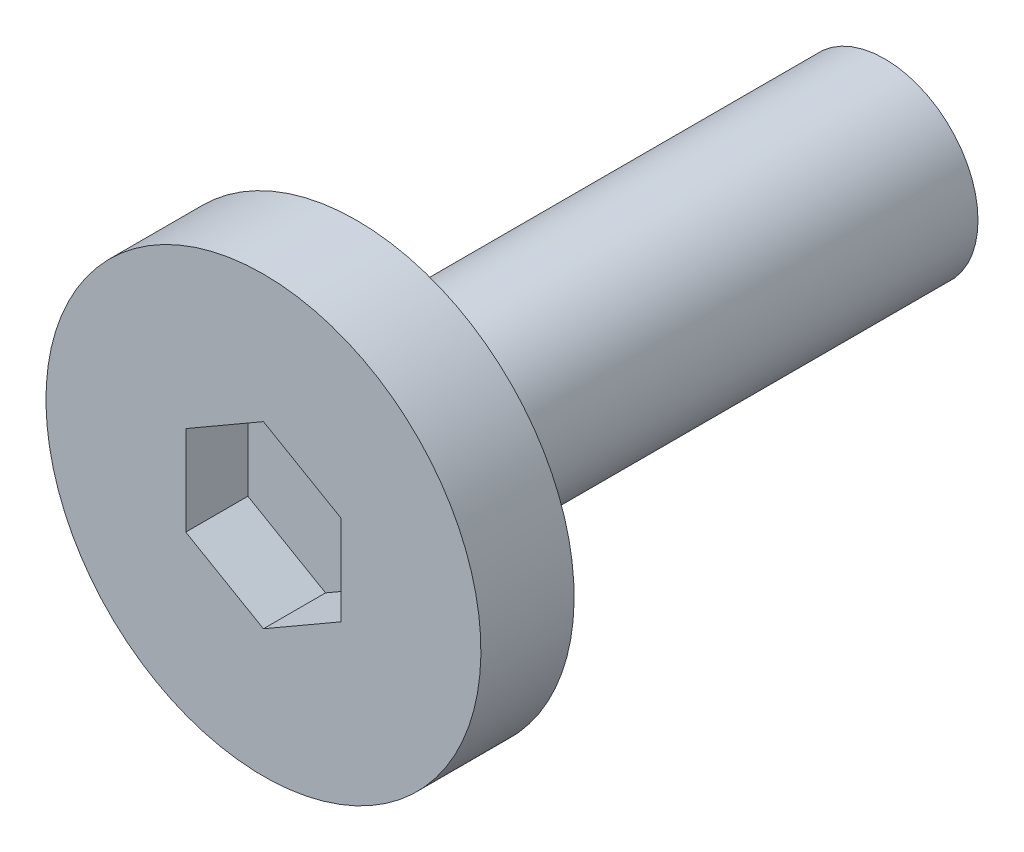
ISO-10303-21;
HEADER;
FILE_DESCRIPTION(('STEP AP214'),'2;1');
FILE_NAME('part.step','',(''),(''),'','','');
FILE_SCHEMA(('AUTOMOTIVE_DESIGN { 1 0 10303 214 1 1 1 1 }'));
ENDSEC;
DATA;
#1=APPLICATION_CONTEXT('core data for automotive mechanical design processes');
#2=APPLICATION_PROTOCOL_DEFINITION('international standard','automotive_design',2000,#1);
#3=PRODUCT_CONTEXT('',#1,'mechanical');
#4=PRODUCT('Part','Part','',(#3));
#5=PRODUCT_RELATED_PRODUCT_CATEGORY('part','',(#4));
#6=PRODUCT_DEFINITION_FORMATION('','',#4);
#7=PRODUCT_DEFINITION_CONTEXT('part definition',#1,'design');
#8=PRODUCT_DEFINITION('design','',#6,#7);
#9=PRODUCT_DEFINITION_SHAPE('','',#8);
#10=(LENGTH_UNIT() NAMED_UNIT(*) SI_UNIT(.MILLI.,.METRE.));
#11=(NAMED_UNIT(*) PLANE_ANGLE_UNIT() SI_UNIT($,.RADIAN.));
#12=(NAMED_UNIT(*) SI_UNIT($,.STERADIAN.) SOLID_ANGLE_UNIT());
#13=UNCERTAINTY_MEASURE_WITH_UNIT(LENGTH_MEASURE(1.E-05),#10,'distance_accuracy_value','');
#14=(GEOMETRIC_REPRESENTATION_CONTEXT(3) GLOBAL_UNCERTAINTY_ASSIGNED_CONTEXT((#13)) GLOBAL_UNIT_ASSIGNED_CONTEXT((#10,
#11,#12)) REPRESENTATION_CONTEXT('',''));
#15=CARTESIAN_POINT('',(0.,0.,0.));
#16=DIRECTION('',(0.,0.,1.));
#17=DIRECTION('',(1.,0.,0.));
#18=AXIS2_PLACEMENT_3D('',#15,#16,#17);
#19=CARTESIAN_POINT('',(172.530839914594,-193.837695743439,112.760489149574));
#20=DIRECTION('',(0.,0.,1.));
#21=DIRECTION('',(1.,0.,0.));
#22=AXIS2_PLACEMENT_3D('',#19,#20,#21);
#23=PLANE('',#22);
#24=DIRECTION('',(0.,-1.,0.));
#25=VECTOR('',#24,1.);
#26=CARTESIAN_POINT('',(171.280839914594,-193.116007906952,112.760489149574));
#27=LINE('',#26,#25);
#28=CARTESIAN_POINT('',(171.280839914594,-193.116007906952,112.760489149574));
#29=VERTEX_POINT('',#28);
#30=CARTESIAN_POINT('',(171.280839914594,-194.559383579927,112.760489149574));
#31=VERTEX_POINT('',#30);
#32=EDGE_CURVE('E139',#29,#31,#27,.T.);
#33=ORIENTED_EDGE('',*,*,#32,.T.);
#34=DIRECTION('',(-0.866025403784438,0.5,0.));
#35=VECTOR('',#34,1.);
#36=CARTESIAN_POINT('',(171.280839914594,-194.559383579927,112.760489149574));
#37=LINE('',#36,#35);
#38=CARTESIAN_POINT('',(172.530839914594,-195.281071416414,112.760489149574));
#39=VERTEX_POINT('',#38);
#40=EDGE_CURVE('E11',#39,#31,#37,.T.);
#41=ORIENTED_EDGE('',*,*,#40,.F.);
#42=DIRECTION('',(-0.866025403784439,-0.5,0.));
#43=VECTOR('',#42,1.);
#44=CARTESIAN_POINT('',(172.530839914594,-195.281071416414,112.760489149574));
#45=LINE('',#44,#43);
#46=CARTESIAN_POINT('',(173.780839914594,-194.559383579927,112.760489149574));
#47=VERTEX_POINT('',#46);
#48=EDGE_CURVE('E138',#47,#39,#45,.T.);
#49=ORIENTED_EDGE('',*,*,#48,.F.);
#50=DIRECTION('',(0.,1.,0.));
#51=VECTOR('',#50,1.);
#52=CARTESIAN_POINT('',(173.780839914594,-194.559383579927,112.760489149574));
#53=LINE('',#52,#51);
#54=CARTESIAN_POINT('',(173.780839914594,-193.116007906952,112.760489149574));
#55=VERTEX_POINT('',#54);
#56=EDGE_CURVE('E112',#47,#55,#53,.T.);
#57=ORIENTED_EDGE('',*,*,#56,.T.);
#58=DIRECTION('',(-0.866025403784439,0.5,0.));
#59=VECTOR('',#58,1.);
#60=CARTESIAN_POINT('',(173.780839914594,-193.116007906952,112.760489149574));
#61=LINE('',#60,#59);
#62=CARTESIAN_POINT('',(172.530839914594,-192.394320070465,112.760489149574));
#63=VERTEX_POINT('',#62);
#64=EDGE_CURVE('E109',#55,#63,#61,.T.);
#65=ORIENTED_EDGE('',*,*,#64,.T.);
#66=DIRECTION('',(-0.866025403784439,-0.5,0.));
#67=VECTOR('',#66,1.);
#68=CARTESIAN_POINT('',(172.530839914594,-192.394320070465,112.760489149574));
#69=LINE('',#68,#67);
#70=EDGE_CURVE('E149',#63,#29,#69,.T.);
#71=ORIENTED_EDGE('',*,*,#70,.T.);
#72=EDGE_LOOP('',(#33,#41,#49,#57,#65,#71));
#73=FACE_BOUND('',#72,.T.);
#74=ADVANCED_FACE('F43',(#73),#23,.T.);
#75=CARTESIAN_POINT('',(171.280839914594,-194.559383579927,116.960489149574));
#76=DIRECTION('',(0.5,0.866025403784438,0.));
#77=DIRECTION('',(0.,0.,-1.));
#78=AXIS2_PLACEMENT_3D('',#75,#76,#77);
#79=PLANE('',#78);
#80=DIRECTION('',(0.,0.,1.));
#81=VECTOR('',#80,1.);
#82=CARTESIAN_POINT('',(172.530839914594,-195.281071416414,116.960489149574));
#83=LINE('',#82,#81);
#84=CARTESIAN_POINT('',(172.530839914594,-195.281071416414,113.760489149574));
#85=VERTEX_POINT('',#84);
#86=EDGE_CURVE('E52',#39,#85,#83,.T.);
#87=ORIENTED_EDGE('',*,*,#86,.F.);
#88=ORIENTED_EDGE('',*,*,#40,.T.);
#89=DIRECTION('',(0.,0.,1.));
#90=VECTOR('',#89,1.);
#91=CARTESIAN_POINT('',(171.280839914594,-194.559383579927,116.960489149574));
#92=LINE('',#91,#90);
#93=CARTESIAN_POINT('',(171.280839914594,-194.559383579927,113.760489149574));
#94=VERTEX_POINT('',#93);
#95=EDGE_CURVE('E141',#31,#94,#92,.T.);
#96=ORIENTED_EDGE('',*,*,#95,.T.);
#97=DIRECTION('',(-0.866025403784438,0.5,0.));
#98=VECTOR('',#97,1.);
#99=CARTESIAN_POINT('',(171.905839914593,-194.92022749817,113.760489149574));
#100=LINE('',#99,#98);
#101=EDGE_CURVE('E135',#85,#94,#100,.T.);
#102=ORIENTED_EDGE('',*,*,#101,.F.);
#103=EDGE_LOOP('',(#87,#88,#96,#102));
#104=FACE_BOUND('',#103,.T.);
#105=ADVANCED_FACE('F169',(#104),#79,.T.);
#106=CARTESIAN_POINT('',(172.530839914594,-195.281071416414,116.960489149574));
#107=DIRECTION('',(-0.5,0.866025403784439,0.));
#108=DIRECTION('',(0.,0.,1.));
#109=AXIS2_PLACEMENT_3D('',#106,#107,#108);
#110=PLANE('',#109);
#111=DIRECTION('',(0.,0.,1.));
#112=VECTOR('',#111,1.);
#113=CARTESIAN_POINT('',(173.780839914594,-194.559383579927,116.960489149574));
#114=LINE('',#113,#112);
#115=CARTESIAN_POINT('',(173.780839914594,-194.559383579927,113.760489149574));
#116=VERTEX_POINT('',#115);
#117=EDGE_CURVE('E118',#47,#116,#114,.T.);
#118=ORIENTED_EDGE('',*,*,#117,.F.);
#119=ORIENTED_EDGE('',*,*,#48,.T.);
#120=ORIENTED_EDGE('',*,*,#86,.T.);
#121=DIRECTION('',(-0.866025403784439,-0.5,0.));
#122=VECTOR('',#121,1.);
#123=CARTESIAN_POINT('',(173.155839914593,-194.92022749817,113.760489149574));
#124=LINE('',#123,#122);
#125=EDGE_CURVE('E122',#116,#85,#124,.T.);
#126=ORIENTED_EDGE('',*,*,#125,.F.);
#127=EDGE_LOOP('',(#118,#119,#120,#126));
#128=FACE_BOUND('',#127,.T.);
#129=ADVANCED_FACE('F175',(#128),#110,.T.);
#130=CARTESIAN_POINT('',(173.780839914594,-194.559383579927,116.960489149574));
#131=DIRECTION('',(-1.,0.,0.));
#132=DIRECTION('',(0.,0.,1.));
#133=AXIS2_PLACEMENT_3D('',#130,#131,#132);
#134=PLANE('',#133);
#135=DIRECTION('',(0.,0.,1.));
#136=VECTOR('',#135,1.);
#137=CARTESIAN_POINT('',(173.780839914594,-193.116007906952,116.960489149574));
#138=LINE('',#137,#136);
#139=CARTESIAN_POINT('',(173.780839914594,-193.116007906952,113.760489149574));
#140=VERTEX_POINT('',#139);
#141=EDGE_CURVE('E102',#55,#140,#138,.T.);
#142=ORIENTED_EDGE('',*,*,#141,.F.);
#143=ORIENTED_EDGE('',*,*,#56,.F.);
#144=ORIENTED_EDGE('',*,*,#117,.T.);
#145=DIRECTION('',(0.,-1.,0.));
#146=VECTOR('',#145,1.);
#147=CARTESIAN_POINT('',(173.780839914594,-193.837695743439,113.760489149574));
#148=LINE('',#147,#146);
#149=EDGE_CURVE('E115',#140,#116,#148,.T.);
#150=ORIENTED_EDGE('',*,*,#149,.F.);
#151=EDGE_LOOP('',(#142,#143,#144,#150));
#152=FACE_BOUND('',#151,.T.);
#153=ADVANCED_FACE('F116',(#152),#134,.T.);
#154=CARTESIAN_POINT('',(173.780839914594,-193.116007906952,116.960489149574));
#155=DIRECTION('',(-0.5,-0.866025403784439,0.));
#156=DIRECTION('',(-0.866025403784439,0.5,0.));
#157=AXIS2_PLACEMENT_3D('',#154,#155,#156);
#158=PLANE('',#157);
#159=DIRECTION('',(0.,0.,1.));
#160=VECTOR('',#159,1.);
#161=CARTESIAN_POINT('',(172.530839914594,-192.394320070465,116.960489149574));
#162=LINE('',#161,#160);
#163=CARTESIAN_POINT('',(172.530839914594,-192.394320070465,113.760489149574));
#164=VERTEX_POINT('',#163);
#165=EDGE_CURVE('E150',#63,#164,#162,.T.);
#166=ORIENTED_EDGE('',*,*,#165,.F.);
#167=ORIENTED_EDGE('',*,*,#64,.F.);
#168=ORIENTED_EDGE('',*,*,#141,.T.);
#169=DIRECTION('',(0.866025403784439,-0.5,0.));
#170=VECTOR('',#169,1.);
#171=CARTESIAN_POINT('',(173.155839914593,-192.755163988709,113.760489149574));
#172=LINE('',#171,#170);
#173=EDGE_CURVE('E107',#164,#140,#172,.T.);
#174=ORIENTED_EDGE('',*,*,#173,.F.);
#175=EDGE_LOOP('',(#166,#167,#168,#174));
#176=FACE_BOUND('',#175,.T.);
#177=ADVANCED_FACE('F105',(#176),#158,.T.);
#178=CARTESIAN_POINT('',(172.530839914594,-192.394320070465,116.960489149574));
#179=DIRECTION('',(0.5,-0.866025403784439,0.));
#180=DIRECTION('',(0.,0.,-1.));
#181=AXIS2_PLACEMENT_3D('',#178,#179,#180);
#182=PLANE('',#181);
#183=DIRECTION('',(0.,0.,1.));
#184=VECTOR('',#183,1.);
#185=CARTESIAN_POINT('',(171.280839914594,-193.116007906952,116.960489149574));
#186=LINE('',#185,#184);
#187=CARTESIAN_POINT('',(171.280839914594,-193.116007906952,113.760489149574));
#188=VERTEX_POINT('',#187);
#189=EDGE_CURVE('E140',#29,#188,#186,.T.);
#190=ORIENTED_EDGE('',*,*,#189,.F.);
#191=ORIENTED_EDGE('',*,*,#70,.F.);
#192=ORIENTED_EDGE('',*,*,#165,.T.);
#193=DIRECTION('',(0.866025403784439,0.5,0.));
#194=VECTOR('',#193,1.);
#195=CARTESIAN_POINT('',(171.905839914593,-192.755163988709,113.760489149574));
#196=LINE('',#195,#194);
#197=EDGE_CURVE('E129',#188,#164,#196,.T.);
#198=ORIENTED_EDGE('',*,*,#197,.F.);
#199=EDGE_LOOP('',(#190,#191,#192,#198));
#200=FACE_BOUND('',#199,.T.);
#201=ADVANCED_FACE('F190',(#200),#182,.T.);
#202=CARTESIAN_POINT('',(171.280839914594,-193.116007906952,116.960489149574));
#203=DIRECTION('',(1.,0.,0.));
#204=DIRECTION('',(0.,1.,0.));
#205=AXIS2_PLACEMENT_3D('',#202,#203,#204);
#206=PLANE('',#205);
#207=ORIENTED_EDGE('',*,*,#95,.F.);
#208=ORIENTED_EDGE('',*,*,#32,.F.);
#209=ORIENTED_EDGE('',*,*,#189,.T.);
#210=DIRECTION('',(0.,1.,0.));
#211=VECTOR('',#210,1.);
#212=CARTESIAN_POINT('',(171.280839914594,-193.837695743439,113.760489149574));
#213=LINE('',#212,#211);
#214=EDGE_CURVE('E131',#94,#188,#213,.T.);
#215=ORIENTED_EDGE('',*,*,#214,.F.);
#216=EDGE_LOOP('',(#207,#208,#209,#215));
#217=FACE_BOUND('',#216,.T.);
#218=ADVANCED_FACE('F172',(#217),#206,.T.);
#219=CARTESIAN_POINT('',(172.530839914594,-193.837695743439,103.760489149574));
#220=DIRECTION('',(0.,0.,-1.));
#221=DIRECTION('',(-1.,0.,0.));
#222=AXIS2_PLACEMENT_3D('',#219,#220,#221);
#223=PLANE('',#222);
#224=CARTESIAN_POINT('',(172.530839914594,-193.837695743439,103.760489149574));
#225=DIRECTION('',(0.,0.,-1.));
#226=DIRECTION('',(0.,1.,0.));
#227=AXIS2_PLACEMENT_3D('',#224,#225,#226);
#228=CIRCLE('',#227,1.5);
#229=CARTESIAN_POINT('',(172.530839914594,-192.337695743439,103.760489149574));
#230=VERTEX_POINT('',#229);
#231=EDGE_CURVE('E161',#230,#230,#228,.T.);
#232=ORIENTED_EDGE('',*,*,#231,.T.);
#233=EDGE_LOOP('',(#232));
#234=FACE_BOUND('',#233,.T.);
#235=ADVANCED_FACE('F206',(#234),#223,.T.);
#236=CARTESIAN_POINT('',(172.530839914594,-193.837695743439,103.760489149574));
#237=DIRECTION('',(0.,0.,1.));
#238=DIRECTION('',(1.,0.,0.));
#239=AXIS2_PLACEMENT_3D('',#236,#237,#238);
#240=CYLINDRICAL_SURFACE('',#239,1.5);
#241=CARTESIAN_POINT('',(172.530839914594,-193.837695743439,112.260489149574));
#242=DIRECTION('',(0.,0.,-1.));
#243=DIRECTION('',(0.,1.,0.));
#244=AXIS2_PLACEMENT_3D('',#241,#242,#243);
#245=CIRCLE('',#244,1.5);
#246=CARTESIAN_POINT('',(172.530839914594,-192.337695743439,112.260489149574));
#247=VERTEX_POINT('',#246);
#248=EDGE_CURVE('E160',#247,#247,#245,.T.);
#249=ORIENTED_EDGE('',*,*,#248,.T.);
#250=EDGE_LOOP('',(#249));
#251=FACE_BOUND('',#250,.T.);
#252=ORIENTED_EDGE('',*,*,#231,.F.);
#253=EDGE_LOOP('',(#252));
#254=FACE_BOUND('',#253,.T.);
#255=ADVANCED_FACE('F201',(#251,#254),#240,.T.);
#256=CARTESIAN_POINT('',(172.530839914594,-193.837695743439,112.260489149574));
#257=DIRECTION('',(0.,0.,1.));
#258=DIRECTION('',(1.,0.,0.));
#259=AXIS2_PLACEMENT_3D('',#256,#257,#258);
#260=PLANE('',#259);
#261=CARTESIAN_POINT('',(172.530839914594,-193.837695743439,112.260489149574));
#262=DIRECTION('',(0.,0.,-1.));
#263=DIRECTION('',(0.,1.,0.));
#264=AXIS2_PLACEMENT_3D('',#261,#262,#263);
#265=CIRCLE('',#264,3.5);
#266=CARTESIAN_POINT('',(172.530839914594,-190.337695743439,112.260489149574));
#267=VERTEX_POINT('',#266);
#268=EDGE_CURVE('E46',#267,#267,#265,.T.);
#269=ORIENTED_EDGE('',*,*,#268,.T.);
#270=EDGE_LOOP('',(#269));
#271=FACE_BOUND('',#270,.T.);
#272=ORIENTED_EDGE('',*,*,#248,.F.);
#273=EDGE_LOOP('',(#272));
#274=FACE_BOUND('',#273,.T.);
#275=ADVANCED_FACE('F197',(#271,#274),#260,.F.);
#276=CARTESIAN_POINT('',(172.530839914594,-193.837695743439,112.260489149574));
#277=DIRECTION('',(0.,0.,1.));
#278=DIRECTION('',(-1.,0.,0.));
#279=AXIS2_PLACEMENT_3D('',#276,#277,#278);
#280=CYLINDRICAL_SURFACE('',#279,3.5);
#281=CARTESIAN_POINT('',(172.530839914594,-193.837695743439,113.760489149574));
#282=DIRECTION('',(0.,0.,-1.));
#283=DIRECTION('',(0.,1.,0.));
#284=AXIS2_PLACEMENT_3D('',#281,#282,#283);
#285=CIRCLE('',#284,3.5);
#286=CARTESIAN_POINT('',(172.530839914594,-190.337695743439,113.760489149574));
#287=VERTEX_POINT('',#286);
#288=EDGE_CURVE('E158',#287,#287,#285,.T.);
#289=ORIENTED_EDGE('',*,*,#288,.T.);
#290=EDGE_LOOP('',(#289));
#291=FACE_BOUND('',#290,.T.);
#292=ORIENTED_EDGE('',*,*,#268,.F.);
#293=EDGE_LOOP('',(#292));
#294=FACE_BOUND('',#293,.T.);
#295=ADVANCED_FACE('F200',(#291,#294),#280,.T.);
#296=CARTESIAN_POINT('',(172.530839914594,-193.837695743439,113.760489149574));
#297=DIRECTION('',(0.,0.,1.));
#298=DIRECTION('',(1.,0.,0.));
#299=AXIS2_PLACEMENT_3D('',#296,#297,#298);
#300=PLANE('',#299);
#301=ORIENTED_EDGE('',*,*,#101,.T.);
#302=ORIENTED_EDGE('',*,*,#214,.T.);
#303=ORIENTED_EDGE('',*,*,#197,.T.);
#304=ORIENTED_EDGE('',*,*,#173,.T.);
#305=ORIENTED_EDGE('',*,*,#149,.T.);
#306=ORIENTED_EDGE('',*,*,#125,.T.);
#307=EDGE_LOOP('',(#301,#302,#303,#304,#305,#306));
#308=FACE_BOUND('',#307,.T.);
#309=ORIENTED_EDGE('',*,*,#288,.F.);
#310=EDGE_LOOP('',(#309));
#311=FACE_BOUND('',#310,.T.);
#312=ADVANCED_FACE('F125',(#308,#311),#300,.T.);
#313=CLOSED_SHELL('',(#74,#105,#129,#153,#177,#201,#218,#235,#255,#275,#295,#312));
#314=MANIFOLD_SOLID_BREP('B2',#313);
#315=ADVANCED_BREP_SHAPE_REPRESENTATION('',(#18,#314),#14);
#316=SHAPE_DEFINITION_REPRESENTATION(#9,#315);
ENDSEC;
END-ISO-10303-21;
